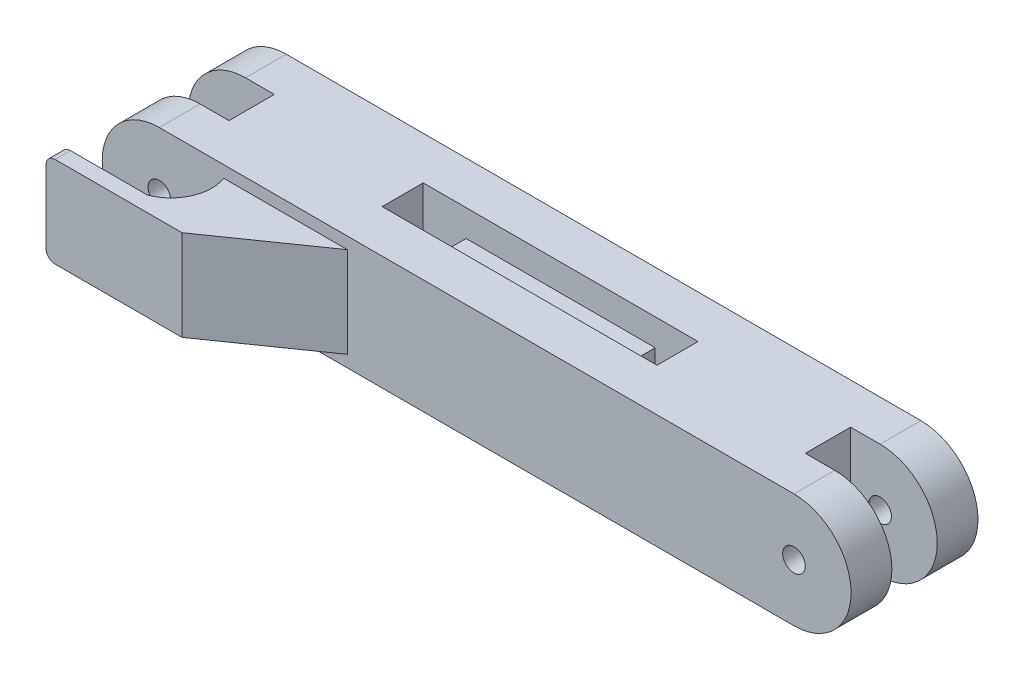
ISO-10303-21;
HEADER;
FILE_DESCRIPTION(('STEP AP214'),'2;1');
FILE_NAME('part.step','',(''),(''),'','','');
FILE_SCHEMA(('AUTOMOTIVE_DESIGN { 1 0 10303 214 1 1 1 1 }'));
ENDSEC;
DATA;
#1=APPLICATION_CONTEXT('core data for automotive mechanical design processes');
#2=APPLICATION_PROTOCOL_DEFINITION('international standard','automotive_design',2000,#1);
#3=PRODUCT_CONTEXT('',#1,'mechanical');
#4=PRODUCT('Part','Part','',(#3));
#5=PRODUCT_RELATED_PRODUCT_CATEGORY('part','',(#4));
#6=PRODUCT_DEFINITION_FORMATION('','',#4);
#7=PRODUCT_DEFINITION_CONTEXT('part definition',#1,'design');
#8=PRODUCT_DEFINITION('design','',#6,#7);
#9=PRODUCT_DEFINITION_SHAPE('','',#8);
#10=(LENGTH_UNIT() NAMED_UNIT(*) SI_UNIT(.MILLI.,.METRE.));
#11=(NAMED_UNIT(*) PLANE_ANGLE_UNIT() SI_UNIT($,.RADIAN.));
#12=(NAMED_UNIT(*) SI_UNIT($,.STERADIAN.) SOLID_ANGLE_UNIT());
#13=UNCERTAINTY_MEASURE_WITH_UNIT(LENGTH_MEASURE(1.E-05),#10,'distance_accuracy_value','');
#14=(GEOMETRIC_REPRESENTATION_CONTEXT(3) GLOBAL_UNCERTAINTY_ASSIGNED_CONTEXT((#13)) GLOBAL_UNIT_ASSIGNED_CONTEXT((#10,
#11,#12)) REPRESENTATION_CONTEXT('',''));
#15=CARTESIAN_POINT('',(0.,0.,0.));
#16=DIRECTION('',(0.,0.,1.));
#17=DIRECTION('',(1.,0.,0.));
#18=AXIS2_PLACEMENT_3D('',#15,#16,#17);
#19=CARTESIAN_POINT('',(-47.2173913043478,-24.0760869565217,11.43));
#20=DIRECTION('',(0.,1.,0.));
#21=DIRECTION('',(0.,0.,1.));
#22=AXIS2_PLACEMENT_3D('',#19,#20,#21);
#23=PLANE('',#22);
#24=DIRECTION('',(-1.,0.,0.));
#25=VECTOR('',#24,1.);
#26=CARTESIAN_POINT('',(-47.2173913043478,-24.0760869565217,23.53));
#27=LINE('',#26,#25);
#28=CARTESIAN_POINT('',(80.1826086956522,-24.0760869565217,23.53));
#29=VERTEX_POINT('',#28);
#30=CARTESIAN_POINT('',(68.1826086956522,-24.0760869565217,23.53));
#31=VERTEX_POINT('',#30);
#32=EDGE_CURVE('E462',#29,#31,#27,.T.);
#33=ORIENTED_EDGE('',*,*,#32,.F.);
#34=DIRECTION('',(0.,0.,-1.));
#35=VECTOR('',#34,1.);
#36=CARTESIAN_POINT('',(80.1826086956522,-24.0760869565217,11.43));
#37=LINE('',#36,#35);
#38=CARTESIAN_POINT('',(80.1826086956522,-24.0760869565217,12.03));
#39=VERTEX_POINT('',#38);
#40=EDGE_CURVE('E455',#29,#39,#37,.T.);
#41=ORIENTED_EDGE('',*,*,#40,.T.);
#42=DIRECTION('',(-1.,0.,0.));
#43=VECTOR('',#42,1.);
#44=CARTESIAN_POINT('',(-47.2173913043478,-24.0760869565217,12.03));
#45=LINE('',#44,#43);
#46=CARTESIAN_POINT('',(68.1826086956522,-24.0760869565217,12.03));
#47=VERTEX_POINT('',#46);
#48=EDGE_CURVE('E457',#39,#47,#45,.T.);
#49=ORIENTED_EDGE('',*,*,#48,.T.);
#50=DIRECTION('',(0.,0.,-1.));
#51=VECTOR('',#50,1.);
#52=CARTESIAN_POINT('',(68.1826086956522,-24.0760869565217,11.43));
#53=LINE('',#52,#51);
#54=EDGE_CURVE('E456',#31,#47,#53,.T.);
#55=ORIENTED_EDGE('',*,*,#54,.F.);
#56=EDGE_LOOP('',(#33,#41,#49,#55));
#57=FACE_BOUND('',#56,.T.);
#58=DIRECTION('',(1.,0.,0.));
#59=VECTOR('',#58,1.);
#60=CARTESIAN_POINT('',(-47.2173913043478,-24.0760869565217,0.));
#61=LINE('',#60,#59);
#62=CARTESIAN_POINT('',(-47.2173913043478,-24.0760869565217,0.));
#63=VERTEX_POINT('',#62);
#64=CARTESIAN_POINT('',(130.582608695652,-24.0760869565217,0.));
#65=VERTEX_POINT('',#64);
#66=EDGE_CURVE('E422',#63,#65,#61,.T.);
#67=ORIENTED_EDGE('',*,*,#66,.T.);
#68=DIRECTION('',(0.,0.,-1.));
#69=VECTOR('',#68,1.);
#70=CARTESIAN_POINT('',(130.582608695652,-24.0760869565217,11.43));
#71=LINE('',#70,#69);
#72=CARTESIAN_POINT('',(130.582608695652,-24.0760869565217,11.43));
#73=VERTEX_POINT('',#72);
#74=EDGE_CURVE('E440',#73,#65,#71,.T.);
#75=ORIENTED_EDGE('',*,*,#74,.F.);
#76=DIRECTION('',(1.,0.,0.));
#77=VECTOR('',#76,1.);
#78=CARTESIAN_POINT('',(-47.2173913043478,-24.0760869565217,11.43));
#79=LINE('',#78,#77);
#80=CARTESIAN_POINT('',(122.327608695652,-24.0760869565217,11.43));
#81=VERTEX_POINT('',#80);
#82=EDGE_CURVE('E406',#81,#73,#79,.T.);
#83=ORIENTED_EDGE('',*,*,#82,.F.);
#84=DIRECTION('',(0.,0.,-1.));
#85=VECTOR('',#84,1.);
#86=CARTESIAN_POINT('',(122.327608695652,-24.0760869565217,24.13));
#87=LINE('',#86,#85);
#88=CARTESIAN_POINT('',(122.327608695652,-24.0760869565217,24.13));
#89=VERTEX_POINT('',#88);
#90=EDGE_CURVE('E373',#89,#81,#87,.T.);
#91=ORIENTED_EDGE('',*,*,#90,.F.);
#92=DIRECTION('',(1.,0.,0.));
#93=VECTOR('',#92,1.);
#94=CARTESIAN_POINT('',(-47.2173913043478,-24.0760869565217,24.13));
#95=LINE('',#94,#93);
#96=CARTESIAN_POINT('',(130.582608695652,-24.0760869565217,24.13));
#97=VERTEX_POINT('',#96);
#98=EDGE_CURVE('E327',#89,#97,#95,.T.);
#99=ORIENTED_EDGE('',*,*,#98,.T.);
#100=DIRECTION('',(0.,0.,-1.));
#101=VECTOR('',#100,1.);
#102=CARTESIAN_POINT('',(130.582608695652,-24.0760869565217,35.56));
#103=LINE('',#102,#101);
#104=CARTESIAN_POINT('',(130.582608695652,-24.0760869565217,35.56));
#105=VERTEX_POINT('',#104);
#106=EDGE_CURVE('E344',#105,#97,#103,.T.);
#107=ORIENTED_EDGE('',*,*,#106,.F.);
#108=DIRECTION('',(1.,0.,0.));
#109=VECTOR('',#108,1.);
#110=CARTESIAN_POINT('',(-47.2173913043478,-24.0760869565217,35.56));
#111=LINE('',#110,#109);
#112=CARTESIAN_POINT('',(-47.2173913043478,-24.0760869565217,35.56));
#113=VERTEX_POINT('',#112);
#114=EDGE_CURVE('E315',#113,#105,#111,.T.);
#115=ORIENTED_EDGE('',*,*,#114,.F.);
#116=DIRECTION('',(0.,0.,-1.));
#117=VECTOR('',#116,1.);
#118=CARTESIAN_POINT('',(-47.2173913043478,-24.0760869565217,35.56));
#119=LINE('',#118,#117);
#120=CARTESIAN_POINT('',(-47.2173913043478,-24.0760869565217,24.13));
#121=VERTEX_POINT('',#120);
#122=EDGE_CURVE('E349',#113,#121,#119,.T.);
#123=ORIENTED_EDGE('',*,*,#122,.T.);
#124=CARTESIAN_POINT('',(-39.1366529566885,-24.0760869565217,24.13));
#125=VERTEX_POINT('',#124);
#126=EDGE_CURVE('E330',#121,#125,#95,.T.);
#127=ORIENTED_EDGE('',*,*,#126,.T.);
#128=DIRECTION('',(0.,0.,-1.));
#129=VECTOR('',#128,1.);
#130=CARTESIAN_POINT('',(-39.1366529566885,-24.0760869565217,24.13));
#131=LINE('',#130,#129);
#132=CARTESIAN_POINT('',(-39.1366529566885,-24.0760869565217,11.43));
#133=VERTEX_POINT('',#132);
#134=EDGE_CURVE('E380',#125,#133,#131,.T.);
#135=ORIENTED_EDGE('',*,*,#134,.T.);
#136=CARTESIAN_POINT('',(-47.2173913043478,-24.0760869565217,11.43));
#137=VERTEX_POINT('',#136);
#138=EDGE_CURVE('E407',#137,#133,#79,.T.);
#139=ORIENTED_EDGE('',*,*,#138,.F.);
#140=DIRECTION('',(0.,0.,-1.));
#141=VECTOR('',#140,1.);
#142=CARTESIAN_POINT('',(-47.2173913043478,-24.0760869565217,11.43));
#143=LINE('',#142,#141);
#144=EDGE_CURVE('E441',#137,#63,#143,.T.);
#145=ORIENTED_EDGE('',*,*,#144,.T.);
#146=EDGE_LOOP('',(#67,#75,#83,#91,#99,#107,#115,#123,#127,#135,#139,#145));
#147=FACE_BOUND('',#146,.T.);
#148=DIRECTION('',(1.,0.,0.));
#149=VECTOR('',#148,1.);
#150=CARTESIAN_POINT('',(-47.2173913043478,-24.0760869565217,12.03));
#151=LINE('',#150,#149);
#152=CARTESIAN_POINT('',(3.1826086956522,-24.0760869565217,12.03));
#153=VERTEX_POINT('',#152);
#154=CARTESIAN_POINT('',(15.1826086956522,-24.0760869565217,12.03));
#155=VERTEX_POINT('',#154);
#156=EDGE_CURVE('E11',#153,#155,#151,.T.);
#157=ORIENTED_EDGE('',*,*,#156,.F.);
#158=DIRECTION('',(0.,0.,1.));
#159=VECTOR('',#158,1.);
#160=CARTESIAN_POINT('',(3.1826086956522,-24.0760869565217,11.43));
#161=LINE('',#160,#159);
#162=CARTESIAN_POINT('',(3.1826086956522,-24.0760869565217,23.53));
#163=VERTEX_POINT('',#162);
#164=EDGE_CURVE('E239',#153,#163,#161,.T.);
#165=ORIENTED_EDGE('',*,*,#164,.T.);
#166=DIRECTION('',(1.,0.,0.));
#167=VECTOR('',#166,1.);
#168=CARTESIAN_POINT('',(-47.2173913043478,-24.0760869565217,23.53));
#169=LINE('',#168,#167);
#170=CARTESIAN_POINT('',(15.1826086956522,-24.0760869565217,23.53));
#171=VERTEX_POINT('',#170);
#172=EDGE_CURVE('E53',#163,#171,#169,.T.);
#173=ORIENTED_EDGE('',*,*,#172,.T.);
#174=DIRECTION('',(0.,0.,1.));
#175=VECTOR('',#174,1.);
#176=CARTESIAN_POINT('',(15.1826086956522,-24.0760869565217,11.43));
#177=LINE('',#176,#175);
#178=EDGE_CURVE('E469',#155,#171,#177,.T.);
#179=ORIENTED_EDGE('',*,*,#178,.F.);
#180=EDGE_LOOP('',(#157,#165,#173,#179));
#181=FACE_BOUND('',#180,.T.);
#182=ADVANCED_FACE('F44',(#57,#147,#181),#23,.F.);
#183=CARTESIAN_POINT('',(-47.2173913043478,-8.07608695652174,35.56));
#184=DIRECTION('',(0.,0.,1.));
#185=DIRECTION('',(1.,0.,0.));
#186=AXIS2_PLACEMENT_3D('',#183,#184,#185);
#187=PLANE('',#186);
#188=DIRECTION('',(0.,-1.,0.));
#189=VECTOR('',#188,1.);
#190=CARTESIAN_POINT('',(5.46367495047442,4.62391304347826,35.56));
#191=LINE('',#190,#189);
#192=CARTESIAN_POINT('',(5.46367495047442,4.62391304347826,35.56));
#193=VERTEX_POINT('',#192);
#194=CARTESIAN_POINT('',(5.46367495047442,-20.7760869565217,35.56));
#195=VERTEX_POINT('',#194);
#196=EDGE_CURVE('E491',#193,#195,#191,.T.);
#197=ORIENTED_EDGE('',*,*,#196,.T.);
#198=DIRECTION('',(-1.,0.,0.));
#199=VECTOR('',#198,1.);
#200=CARTESIAN_POINT('',(-34.5173913043478,-20.7760869565217,35.56));
#201=LINE('',#200,#199);
#202=CARTESIAN_POINT('',(-29.1833913043478,-20.7760869565217,35.56));
#203=VERTEX_POINT('',#202);
#204=EDGE_CURVE('E303',#195,#203,#201,.T.);
#205=ORIENTED_EDGE('',*,*,#204,.T.);
#206=DIRECTION('',(0.,1.,0.));
#207=VECTOR('',#206,1.);
#208=CARTESIAN_POINT('',(-29.1833913043478,-25.8560869565217,35.56));
#209=LINE('',#208,#207);
#210=CARTESIAN_POINT('',(-29.1833913043478,4.62391304347826,35.56));
#211=VERTEX_POINT('',#210);
#212=EDGE_CURVE('E508',#203,#211,#209,.T.);
#213=ORIENTED_EDGE('',*,*,#212,.T.);
#214=DIRECTION('',(1.,0.,0.));
#215=VECTOR('',#214,1.);
#216=CARTESIAN_POINT('',(-34.5173913043478,4.62391304347826,35.56));
#217=LINE('',#216,#215);
#218=EDGE_CURVE('E444',#211,#193,#217,.T.);
#219=ORIENTED_EDGE('',*,*,#218,.T.);
#220=EDGE_LOOP('',(#197,#205,#213,#219));
#221=FACE_BOUND('',#220,.T.);
#222=CARTESIAN_POINT('',(-47.2173913043478,-8.07608695652174,35.56));
#223=DIRECTION('',(0.,0.,1.));
#224=DIRECTION('',(1.,0.,0.));
#225=AXIS2_PLACEMENT_3D('',#222,#223,#224);
#226=CIRCLE('',#225,16.);
#227=CARTESIAN_POINT('',(-47.2173913043478,7.92391304347826,35.56));
#228=VERTEX_POINT('',#227);
#229=EDGE_CURVE('E307',#228,#113,#226,.T.);
#230=ORIENTED_EDGE('',*,*,#229,.T.);
#231=ORIENTED_EDGE('',*,*,#114,.T.);
#232=CARTESIAN_POINT('',(130.582608695652,-8.07608695652174,35.56));
#233=DIRECTION('',(0.,0.,1.));
#234=DIRECTION('',(1.,0.,0.));
#235=AXIS2_PLACEMENT_3D('',#232,#233,#234);
#236=CIRCLE('',#235,16.);
#237=CARTESIAN_POINT('',(130.582608695652,7.92391304347826,35.56));
#238=VERTEX_POINT('',#237);
#239=EDGE_CURVE('E317',#105,#238,#236,.T.);
#240=ORIENTED_EDGE('',*,*,#239,.T.);
#241=DIRECTION('',(-1.,0.,0.));
#242=VECTOR('',#241,1.);
#243=CARTESIAN_POINT('',(-47.2173913043478,7.92391304347826,35.56));
#244=LINE('',#243,#242);
#245=EDGE_CURVE('E316',#238,#228,#244,.T.);
#246=ORIENTED_EDGE('',*,*,#245,.T.);
#247=EDGE_LOOP('',(#230,#231,#240,#246));
#248=FACE_BOUND('',#247,.T.);
#249=CARTESIAN_POINT('',(130.582608695652,-8.07608695652174,35.56));
#250=DIRECTION('',(0.,0.,1.));
#251=DIRECTION('',(1.,0.,0.));
#252=AXIS2_PLACEMENT_3D('',#249,#250,#251);
#253=CIRCLE('',#252,3.175);
#254=CARTESIAN_POINT('',(133.757608695652,-8.07608695652174,35.56));
#255=VERTEX_POINT('',#254);
#256=EDGE_CURVE('E293',#255,#255,#253,.T.);
#257=ORIENTED_EDGE('',*,*,#256,.F.);
#258=EDGE_LOOP('',(#257));
#259=FACE_BOUND('',#258,.T.);
#260=CARTESIAN_POINT('',(-47.2173913043478,-8.07608695652174,35.56));
#261=DIRECTION('',(0.,0.,1.));
#262=DIRECTION('',(1.,0.,0.));
#263=AXIS2_PLACEMENT_3D('',#260,#261,#262);
#264=CIRCLE('',#263,3.175);
#265=CARTESIAN_POINT('',(-44.0423913043478,-8.07608695652174,35.56));
#266=VERTEX_POINT('',#265);
#267=EDGE_CURVE('E299',#266,#266,#264,.T.);
#268=ORIENTED_EDGE('',*,*,#267,.F.);
#269=EDGE_LOOP('',(#268));
#270=FACE_BOUND('',#269,.T.);
#271=ADVANCED_FACE('F596',(#221,#248,#259,#270),#187,.T.);
#272=CARTESIAN_POINT('',(-47.2173913043478,7.92391304347826,11.43));
#273=DIRECTION('',(0.,-1.,0.));
#274=DIRECTION('',(0.,0.,-1.));
#275=AXIS2_PLACEMENT_3D('',#272,#273,#274);
#276=PLANE('',#275);
#277=DIRECTION('',(-1.,0.,0.));
#278=VECTOR('',#277,1.);
#279=CARTESIAN_POINT('',(-47.2173913043478,7.92391304347826,0.));
#280=LINE('',#279,#278);
#281=CARTESIAN_POINT('',(130.582608695652,7.92391304347826,0.));
#282=VERTEX_POINT('',#281);
#283=CARTESIAN_POINT('',(-47.2173913043478,7.92391304347826,0.));
#284=VERTEX_POINT('',#283);
#285=EDGE_CURVE('E410',#282,#284,#280,.T.);
#286=ORIENTED_EDGE('',*,*,#285,.T.);
#287=DIRECTION('',(0.,0.,-1.));
#288=VECTOR('',#287,1.);
#289=CARTESIAN_POINT('',(-47.2173913043478,7.92391304347826,11.43));
#290=LINE('',#289,#288);
#291=CARTESIAN_POINT('',(-47.2173913043478,7.92391304347826,11.43));
#292=VERTEX_POINT('',#291);
#293=EDGE_CURVE('E417',#292,#284,#290,.T.);
#294=ORIENTED_EDGE('',*,*,#293,.F.);
#295=DIRECTION('',(-1.,0.,0.));
#296=VECTOR('',#295,1.);
#297=CARTESIAN_POINT('',(-47.2173913043478,7.92391304347826,11.43));
#298=LINE('',#297,#296);
#299=CARTESIAN_POINT('',(-39.1366529566885,7.92391304347826,11.43));
#300=VERTEX_POINT('',#299);
#301=EDGE_CURVE('E414',#300,#292,#298,.T.);
#302=ORIENTED_EDGE('',*,*,#301,.F.);
#303=DIRECTION('',(0.,0.,-1.));
#304=VECTOR('',#303,1.);
#305=CARTESIAN_POINT('',(-39.1366529566885,7.92391304347824,24.13));
#306=LINE('',#305,#304);
#307=CARTESIAN_POINT('',(-39.1366529566885,7.92391304347824,24.13));
#308=VERTEX_POINT('',#307);
#309=EDGE_CURVE('E382',#308,#300,#306,.T.);
#310=ORIENTED_EDGE('',*,*,#309,.F.);
#311=DIRECTION('',(-1.,0.,0.));
#312=VECTOR('',#311,1.);
#313=CARTESIAN_POINT('',(-47.2173913043478,7.92391304347826,24.13));
#314=LINE('',#313,#312);
#315=CARTESIAN_POINT('',(-47.2173913043478,7.92391304347826,24.13));
#316=VERTEX_POINT('',#315);
#317=EDGE_CURVE('E333',#308,#316,#314,.T.);
#318=ORIENTED_EDGE('',*,*,#317,.T.);
#319=DIRECTION('',(0.,0.,-1.));
#320=VECTOR('',#319,1.);
#321=CARTESIAN_POINT('',(-47.2173913043478,7.92391304347826,35.56));
#322=LINE('',#321,#320);
#323=EDGE_CURVE('E325',#228,#316,#322,.T.);
#324=ORIENTED_EDGE('',*,*,#323,.F.);
#325=ORIENTED_EDGE('',*,*,#245,.F.);
#326=DIRECTION('',(0.,0.,-1.));
#327=VECTOR('',#326,1.);
#328=CARTESIAN_POINT('',(130.582608695652,7.92391304347826,35.56));
#329=LINE('',#328,#327);
#330=CARTESIAN_POINT('',(130.582608695652,7.92391304347826,24.13));
#331=VERTEX_POINT('',#330);
#332=EDGE_CURVE('E341',#238,#331,#329,.T.);
#333=ORIENTED_EDGE('',*,*,#332,.T.);
#334=CARTESIAN_POINT('',(122.327608695652,7.92391304347826,24.13));
#335=VERTEX_POINT('',#334);
#336=EDGE_CURVE('E312',#331,#335,#314,.T.);
#337=ORIENTED_EDGE('',*,*,#336,.T.);
#338=DIRECTION('',(0.,0.,-1.));
#339=VECTOR('',#338,1.);
#340=CARTESIAN_POINT('',(122.327608695652,7.92391304347826,24.13));
#341=LINE('',#340,#339);
#342=CARTESIAN_POINT('',(122.327608695652,7.92391304347826,11.43));
#343=VERTEX_POINT('',#342);
#344=EDGE_CURVE('E361',#335,#343,#341,.T.);
#345=ORIENTED_EDGE('',*,*,#344,.T.);
#346=CARTESIAN_POINT('',(130.582608695652,7.92391304347826,11.43));
#347=VERTEX_POINT('',#346);
#348=EDGE_CURVE('E411',#347,#343,#298,.T.);
#349=ORIENTED_EDGE('',*,*,#348,.F.);
#350=DIRECTION('',(0.,0.,-1.));
#351=VECTOR('',#350,1.);
#352=CARTESIAN_POINT('',(130.582608695652,7.92391304347826,11.43));
#353=LINE('',#352,#351);
#354=EDGE_CURVE('E433',#347,#282,#353,.T.);
#355=ORIENTED_EDGE('',*,*,#354,.T.);
#356=EDGE_LOOP('',(#286,#294,#302,#310,#318,#324,#325,#333,#337,#345,#349,#355));
#357=FACE_BOUND('',#356,.T.);
#358=DIRECTION('',(0.,0.,-1.));
#359=VECTOR('',#358,1.);
#360=CARTESIAN_POINT('',(3.1826086956522,7.92391304347826,23.53));
#361=LINE('',#360,#359);
#362=CARTESIAN_POINT('',(3.1826086956522,7.92391304347826,23.53));
#363=VERTEX_POINT('',#362);
#364=CARTESIAN_POINT('',(3.1826086956522,7.92391304347826,12.03));
#365=VERTEX_POINT('',#364);
#366=EDGE_CURVE('E266',#363,#365,#361,.T.);
#367=ORIENTED_EDGE('',*,*,#366,.T.);
#368=DIRECTION('',(1.,0.,0.));
#369=VECTOR('',#368,1.);
#370=CARTESIAN_POINT('',(3.1826086956522,7.92391304347826,12.03));
#371=LINE('',#370,#369);
#372=CARTESIAN_POINT('',(80.1826086956522,7.92391304347826,12.03));
#373=VERTEX_POINT('',#372);
#374=EDGE_CURVE('E269',#365,#373,#371,.T.);
#375=ORIENTED_EDGE('',*,*,#374,.T.);
#376=DIRECTION('',(0.,0.,-1.));
#377=VECTOR('',#376,1.);
#378=CARTESIAN_POINT('',(80.1826086956522,7.92391304347826,23.53));
#379=LINE('',#378,#377);
#380=CARTESIAN_POINT('',(80.1826086956522,7.92391304347826,23.53));
#381=VERTEX_POINT('',#380);
#382=EDGE_CURVE('E259',#381,#373,#379,.T.);
#383=ORIENTED_EDGE('',*,*,#382,.F.);
#384=DIRECTION('',(1.,0.,0.));
#385=VECTOR('',#384,1.);
#386=CARTESIAN_POINT('',(3.1826086956522,7.92391304347826,23.53));
#387=LINE('',#386,#385);
#388=EDGE_CURVE('E251',#363,#381,#387,.T.);
#389=ORIENTED_EDGE('',*,*,#388,.F.);
#390=EDGE_LOOP('',(#367,#375,#383,#389));
#391=FACE_BOUND('',#390,.T.);
#392=ADVANCED_FACE('F601',(#357,#391),#276,.F.);
#393=CARTESIAN_POINT('',(-47.2173913043478,-8.07608695652174,11.43));
#394=DIRECTION('',(0.,0.,1.));
#395=DIRECTION('',(1.,0.,0.));
#396=AXIS2_PLACEMENT_3D('',#393,#394,#395);
#397=PLANE('',#396);
#398=DIRECTION('',(0.,1.,0.));
#399=VECTOR('',#398,1.);
#400=CARTESIAN_POINT('',(122.327608695652,-24.0760869565217,11.43));
#401=LINE('',#400,#399);
#402=EDGE_CURVE('E360',#81,#343,#401,.T.);
#403=ORIENTED_EDGE('',*,*,#402,.F.);
#404=ORIENTED_EDGE('',*,*,#82,.T.);
#405=CARTESIAN_POINT('',(130.582608695652,-8.07608695652174,11.43));
#406=DIRECTION('',(0.,0.,1.));
#407=DIRECTION('',(1.,0.,0.));
#408=AXIS2_PLACEMENT_3D('',#405,#406,#407);
#409=CIRCLE('',#408,16.);
#410=EDGE_CURVE('E412',#73,#347,#409,.T.);
#411=ORIENTED_EDGE('',*,*,#410,.T.);
#412=ORIENTED_EDGE('',*,*,#348,.T.);
#413=EDGE_LOOP('',(#403,#404,#411,#412));
#414=FACE_BOUND('',#413,.T.);
#415=CARTESIAN_POINT('',(130.582608695652,-8.07608695652174,11.43));
#416=DIRECTION('',(0.,0.,1.));
#417=DIRECTION('',(1.,0.,0.));
#418=AXIS2_PLACEMENT_3D('',#415,#416,#417);
#419=CIRCLE('',#418,3.175);
#420=CARTESIAN_POINT('',(133.757608695652,-8.07608695652174,11.43));
#421=VERTEX_POINT('',#420);
#422=EDGE_CURVE('E386',#421,#421,#419,.T.);
#423=ORIENTED_EDGE('',*,*,#422,.F.);
#424=EDGE_LOOP('',(#423));
#425=FACE_BOUND('',#424,.T.);
#426=ADVANCED_FACE('F673',(#414,#425),#397,.T.);
#427=DIRECTION('',(0.,-1.,0.));
#428=VECTOR('',#427,1.);
#429=CARTESIAN_POINT('',(-39.1366529566885,-24.0760869565217,11.43));
#430=LINE('',#429,#428);
#431=EDGE_CURVE('E352',#300,#133,#430,.T.);
#432=ORIENTED_EDGE('',*,*,#431,.F.);
#433=ORIENTED_EDGE('',*,*,#301,.T.);
#434=CARTESIAN_POINT('',(-47.2173913043478,-8.07608695652174,11.43));
#435=DIRECTION('',(0.,0.,1.));
#436=DIRECTION('',(1.,0.,0.));
#437=AXIS2_PLACEMENT_3D('',#434,#435,#436);
#438=CIRCLE('',#437,16.);
#439=EDGE_CURVE('E405',#292,#137,#438,.T.);
#440=ORIENTED_EDGE('',*,*,#439,.T.);
#441=ORIENTED_EDGE('',*,*,#138,.T.);
#442=EDGE_LOOP('',(#432,#433,#440,#441));
#443=FACE_BOUND('',#442,.T.);
#444=CARTESIAN_POINT('',(-47.2173913043478,-8.07608695652174,11.43));
#445=DIRECTION('',(0.,0.,1.));
#446=DIRECTION('',(1.,0.,0.));
#447=AXIS2_PLACEMENT_3D('',#444,#445,#446);
#448=CIRCLE('',#447,3.175);
#449=CARTESIAN_POINT('',(-44.0423913043478,-8.07608695652174,11.43));
#450=VERTEX_POINT('',#449);
#451=EDGE_CURVE('E394',#450,#450,#448,.T.);
#452=ORIENTED_EDGE('',*,*,#451,.F.);
#453=EDGE_LOOP('',(#452));
#454=FACE_BOUND('',#453,.T.);
#455=ADVANCED_FACE('F680',(#443,#454),#397,.T.);
#456=CARTESIAN_POINT('',(-47.2173913043478,-8.07608695652174,0.));
#457=DIRECTION('',(0.,0.,1.));
#458=DIRECTION('',(1.,0.,0.));
#459=AXIS2_PLACEMENT_3D('',#456,#457,#458);
#460=PLANE('',#459);
#461=CARTESIAN_POINT('',(-47.2173913043478,-8.07608695652174,0.));
#462=DIRECTION('',(0.,0.,1.));
#463=DIRECTION('',(1.,0.,0.));
#464=AXIS2_PLACEMENT_3D('',#461,#462,#463);
#465=CIRCLE('',#464,16.);
#466=EDGE_CURVE('E397',#284,#63,#465,.T.);
#467=ORIENTED_EDGE('',*,*,#466,.F.);
#468=ORIENTED_EDGE('',*,*,#285,.F.);
#469=CARTESIAN_POINT('',(130.582608695652,-8.07608695652174,0.));
#470=DIRECTION('',(0.,0.,1.));
#471=DIRECTION('',(1.,0.,0.));
#472=AXIS2_PLACEMENT_3D('',#469,#470,#471);
#473=CIRCLE('',#472,16.);
#474=EDGE_CURVE('E424',#65,#282,#473,.T.);
#475=ORIENTED_EDGE('',*,*,#474,.F.);
#476=ORIENTED_EDGE('',*,*,#66,.F.);
#477=EDGE_LOOP('',(#467,#468,#475,#476));
#478=FACE_BOUND('',#477,.T.);
#479=CARTESIAN_POINT('',(-47.2173913043478,-8.07608695652174,0.));
#480=DIRECTION('',(0.,0.,1.));
#481=DIRECTION('',(1.,0.,0.));
#482=AXIS2_PLACEMENT_3D('',#479,#480,#481);
#483=CIRCLE('',#482,3.175);
#484=CARTESIAN_POINT('',(-44.0423913043478,-8.07608695652174,0.));
#485=VERTEX_POINT('',#484);
#486=EDGE_CURVE('E389',#485,#485,#483,.T.);
#487=ORIENTED_EDGE('',*,*,#486,.T.);
#488=EDGE_LOOP('',(#487));
#489=FACE_BOUND('',#488,.T.);
#490=CARTESIAN_POINT('',(130.582608695652,-8.07608695652174,0.));
#491=DIRECTION('',(0.,0.,1.));
#492=DIRECTION('',(1.,0.,0.));
#493=AXIS2_PLACEMENT_3D('',#490,#491,#492);
#494=CIRCLE('',#493,3.175);
#495=CARTESIAN_POINT('',(133.757608695652,-8.07608695652174,0.));
#496=VERTEX_POINT('',#495);
#497=EDGE_CURVE('E383',#496,#496,#494,.T.);
#498=ORIENTED_EDGE('',*,*,#497,.T.);
#499=EDGE_LOOP('',(#498));
#500=FACE_BOUND('',#499,.T.);
#501=ADVANCED_FACE('F674',(#478,#489,#500),#460,.F.);
#502=CARTESIAN_POINT('',(-47.2173913043478,-8.07608695652174,11.43));
#503=DIRECTION('',(0.,0.,-1.));
#504=DIRECTION('',(-1.,0.,0.));
#505=AXIS2_PLACEMENT_3D('',#502,#503,#504);
#506=CYLINDRICAL_SURFACE('',#505,16.);
#507=ORIENTED_EDGE('',*,*,#466,.T.);
#508=ORIENTED_EDGE('',*,*,#144,.F.);
#509=ORIENTED_EDGE('',*,*,#439,.F.);
#510=ORIENTED_EDGE('',*,*,#293,.T.);
#511=EDGE_LOOP('',(#507,#508,#509,#510));
#512=FACE_BOUND('',#511,.T.);
#513=ADVANCED_FACE('F50',(#512),#506,.T.);
#514=CARTESIAN_POINT('',(130.582608695652,-8.07608695652174,11.43));
#515=DIRECTION('',(0.,0.,-1.));
#516=DIRECTION('',(-1.,0.,0.));
#517=AXIS2_PLACEMENT_3D('',#514,#515,#516);
#518=CYLINDRICAL_SURFACE('',#517,16.);
#519=ORIENTED_EDGE('',*,*,#474,.T.);
#520=ORIENTED_EDGE('',*,*,#354,.F.);
#521=ORIENTED_EDGE('',*,*,#410,.F.);
#522=ORIENTED_EDGE('',*,*,#74,.T.);
#523=EDGE_LOOP('',(#519,#520,#521,#522));
#524=FACE_BOUND('',#523,.T.);
#525=ADVANCED_FACE('F670',(#524),#518,.T.);
#526=CARTESIAN_POINT('',(-47.2173913043478,-8.07608695652174,11.43));
#527=DIRECTION('',(0.,0.,-1.));
#528=DIRECTION('',(-1.,0.,0.));
#529=AXIS2_PLACEMENT_3D('',#526,#527,#528);
#530=CYLINDRICAL_SURFACE('',#529,3.175);
#531=ORIENTED_EDGE('',*,*,#451,.T.);
#532=EDGE_LOOP('',(#531));
#533=FACE_BOUND('',#532,.T.);
#534=ORIENTED_EDGE('',*,*,#486,.F.);
#535=EDGE_LOOP('',(#534));
#536=FACE_BOUND('',#535,.T.);
#537=ADVANCED_FACE('F669',(#533,#536),#530,.F.);
#538=CARTESIAN_POINT('',(130.582608695652,-8.07608695652174,11.43));
#539=DIRECTION('',(0.,0.,-1.));
#540=DIRECTION('',(-1.,0.,0.));
#541=AXIS2_PLACEMENT_3D('',#538,#539,#540);
#542=CYLINDRICAL_SURFACE('',#541,3.175);
#543=ORIENTED_EDGE('',*,*,#422,.T.);
#544=EDGE_LOOP('',(#543));
#545=FACE_BOUND('',#544,.T.);
#546=ORIENTED_EDGE('',*,*,#497,.F.);
#547=EDGE_LOOP('',(#546));
#548=FACE_BOUND('',#547,.T.);
#549=ADVANCED_FACE('F685',(#545,#548),#542,.F.);
#550=CARTESIAN_POINT('',(-39.1366529566885,-24.0760869565217,24.13));
#551=DIRECTION('',(1.,0.,0.));
#552=DIRECTION('',(0.,0.,-1.));
#553=AXIS2_PLACEMENT_3D('',#550,#551,#552);
#554=PLANE('',#553);
#555=ORIENTED_EDGE('',*,*,#431,.T.);
#556=ORIENTED_EDGE('',*,*,#134,.F.);
#557=DIRECTION('',(0.,-1.,0.));
#558=VECTOR('',#557,1.);
#559=CARTESIAN_POINT('',(-39.1366529566885,-24.0760869565217,24.13));
#560=LINE('',#559,#558);
#561=EDGE_CURVE('E353',#308,#125,#560,.T.);
#562=ORIENTED_EDGE('',*,*,#561,.F.);
#563=ORIENTED_EDGE('',*,*,#309,.T.);
#564=EDGE_LOOP('',(#555,#556,#562,#563));
#565=FACE_BOUND('',#564,.T.);
#566=ADVANCED_FACE('F686',(#565),#554,.F.);
#567=CARTESIAN_POINT('',(122.327608695652,-24.0760869565217,24.13));
#568=DIRECTION('',(-1.,0.,0.));
#569=DIRECTION('',(0.,0.,1.));
#570=AXIS2_PLACEMENT_3D('',#567,#568,#569);
#571=PLANE('',#570);
#572=ORIENTED_EDGE('',*,*,#402,.T.);
#573=ORIENTED_EDGE('',*,*,#344,.F.);
#574=DIRECTION('',(0.,1.,0.));
#575=VECTOR('',#574,1.);
#576=CARTESIAN_POINT('',(122.327608695652,-24.0760869565217,24.13));
#577=LINE('',#576,#575);
#578=EDGE_CURVE('E356',#89,#335,#577,.T.);
#579=ORIENTED_EDGE('',*,*,#578,.F.);
#580=ORIENTED_EDGE('',*,*,#90,.T.);
#581=EDGE_LOOP('',(#572,#573,#579,#580));
#582=FACE_BOUND('',#581,.T.);
#583=ADVANCED_FACE('F625',(#582),#571,.F.);
#584=CARTESIAN_POINT('',(-47.2173913043478,-8.07608695652174,24.13));
#585=DIRECTION('',(0.,0.,1.));
#586=DIRECTION('',(1.,0.,0.));
#587=AXIS2_PLACEMENT_3D('',#584,#585,#586);
#588=PLANE('',#587);
#589=CARTESIAN_POINT('',(-47.2173913043478,-8.07608695652174,24.13));
#590=DIRECTION('',(0.,0.,1.));
#591=DIRECTION('',(1.,0.,0.));
#592=AXIS2_PLACEMENT_3D('',#589,#590,#591);
#593=CIRCLE('',#592,3.175);
#594=CARTESIAN_POINT('',(-44.0423913043478,-8.07608695652174,24.13));
#595=VERTEX_POINT('',#594);
#596=EDGE_CURVE('E294',#595,#595,#593,.T.);
#597=ORIENTED_EDGE('',*,*,#596,.T.);
#598=EDGE_LOOP('',(#597));
#599=FACE_BOUND('',#598,.T.);
#600=ORIENTED_EDGE('',*,*,#317,.F.);
#601=ORIENTED_EDGE('',*,*,#561,.T.);
#602=ORIENTED_EDGE('',*,*,#126,.F.);
#603=CARTESIAN_POINT('',(-47.2173913043478,-8.07608695652174,24.13));
#604=DIRECTION('',(0.,0.,1.));
#605=DIRECTION('',(1.,0.,0.));
#606=AXIS2_PLACEMENT_3D('',#603,#604,#605);
#607=CIRCLE('',#606,16.);
#608=EDGE_CURVE('E308',#316,#121,#607,.T.);
#609=ORIENTED_EDGE('',*,*,#608,.F.);
#610=EDGE_LOOP('',(#600,#601,#602,#609));
#611=FACE_BOUND('',#610,.T.);
#612=ADVANCED_FACE('F616',(#599,#611),#588,.F.);
#613=CARTESIAN_POINT('',(130.582608695652,-8.07608695652174,24.13));
#614=DIRECTION('',(0.,0.,1.));
#615=DIRECTION('',(1.,0.,0.));
#616=AXIS2_PLACEMENT_3D('',#613,#614,#615);
#617=CIRCLE('',#616,3.175);
#618=CARTESIAN_POINT('',(133.757608695652,-8.07608695652174,24.13));
#619=VERTEX_POINT('',#618);
#620=EDGE_CURVE('E289',#619,#619,#617,.T.);
#621=ORIENTED_EDGE('',*,*,#620,.T.);
#622=EDGE_LOOP('',(#621));
#623=FACE_BOUND('',#622,.T.);
#624=ORIENTED_EDGE('',*,*,#98,.F.);
#625=ORIENTED_EDGE('',*,*,#578,.T.);
#626=ORIENTED_EDGE('',*,*,#336,.F.);
#627=CARTESIAN_POINT('',(130.582608695652,-8.07608695652174,24.13));
#628=DIRECTION('',(0.,0.,1.));
#629=DIRECTION('',(1.,0.,0.));
#630=AXIS2_PLACEMENT_3D('',#627,#628,#629);
#631=CIRCLE('',#630,16.);
#632=EDGE_CURVE('E331',#97,#331,#631,.T.);
#633=ORIENTED_EDGE('',*,*,#632,.F.);
#634=EDGE_LOOP('',(#624,#625,#626,#633));
#635=FACE_BOUND('',#634,.T.);
#636=ADVANCED_FACE('F623',(#623,#635),#588,.F.);
#637=CARTESIAN_POINT('',(-47.2173913043478,-8.07608695652174,35.56));
#638=DIRECTION('',(0.,0.,-1.));
#639=DIRECTION('',(-1.,0.,0.));
#640=AXIS2_PLACEMENT_3D('',#637,#638,#639);
#641=CYLINDRICAL_SURFACE('',#640,16.);
#642=ORIENTED_EDGE('',*,*,#608,.T.);
#643=ORIENTED_EDGE('',*,*,#122,.F.);
#644=ORIENTED_EDGE('',*,*,#229,.F.);
#645=ORIENTED_EDGE('',*,*,#323,.T.);
#646=EDGE_LOOP('',(#642,#643,#644,#645));
#647=FACE_BOUND('',#646,.T.);
#648=ADVANCED_FACE('F650',(#647),#641,.T.);
#649=CARTESIAN_POINT('',(130.582608695652,-8.07608695652174,35.56));
#650=DIRECTION('',(0.,0.,-1.));
#651=DIRECTION('',(-1.,0.,0.));
#652=AXIS2_PLACEMENT_3D('',#649,#650,#651);
#653=CYLINDRICAL_SURFACE('',#652,16.);
#654=ORIENTED_EDGE('',*,*,#632,.T.);
#655=ORIENTED_EDGE('',*,*,#332,.F.);
#656=ORIENTED_EDGE('',*,*,#239,.F.);
#657=ORIENTED_EDGE('',*,*,#106,.T.);
#658=EDGE_LOOP('',(#654,#655,#656,#657));
#659=FACE_BOUND('',#658,.T.);
#660=ADVANCED_FACE('F613',(#659),#653,.T.);
#661=CARTESIAN_POINT('',(-47.2173913043478,-8.07608695652174,35.56));
#662=DIRECTION('',(0.,0.,-1.));
#663=DIRECTION('',(-1.,0.,0.));
#664=AXIS2_PLACEMENT_3D('',#661,#662,#663);
#665=CYLINDRICAL_SURFACE('',#664,3.175);
#666=ORIENTED_EDGE('',*,*,#267,.T.);
#667=EDGE_LOOP('',(#666));
#668=FACE_BOUND('',#667,.T.);
#669=ORIENTED_EDGE('',*,*,#596,.F.);
#670=EDGE_LOOP('',(#669));
#671=FACE_BOUND('',#670,.T.);
#672=ADVANCED_FACE('F606',(#668,#671),#665,.F.);
#673=CARTESIAN_POINT('',(130.582608695652,-8.07608695652174,35.56));
#674=DIRECTION('',(0.,0.,-1.));
#675=DIRECTION('',(-1.,0.,0.));
#676=AXIS2_PLACEMENT_3D('',#673,#674,#675);
#677=CYLINDRICAL_SURFACE('',#676,3.175);
#678=ORIENTED_EDGE('',*,*,#256,.T.);
#679=EDGE_LOOP('',(#678));
#680=FACE_BOUND('',#679,.T.);
#681=ORIENTED_EDGE('',*,*,#620,.F.);
#682=EDGE_LOOP('',(#681));
#683=FACE_BOUND('',#682,.T.);
#684=ADVANCED_FACE('F612',(#680,#683),#677,.F.);
#685=CARTESIAN_POINT('',(3.1826086956522,0.423913043478259,23.53));
#686=DIRECTION('',(1.,0.,0.));
#687=DIRECTION('',(0.,0.,-1.));
#688=AXIS2_PLACEMENT_3D('',#685,#686,#687);
#689=PLANE('',#688);
#690=ORIENTED_EDGE('',*,*,#366,.F.);
#691=DIRECTION('',(0.,1.,0.));
#692=VECTOR('',#691,1.);
#693=CARTESIAN_POINT('',(3.1826086956522,0.423913043478259,23.53));
#694=LINE('',#693,#692);
#695=EDGE_CURVE('E61',#163,#363,#694,.T.);
#696=ORIENTED_EDGE('',*,*,#695,.F.);
#697=ORIENTED_EDGE('',*,*,#164,.F.);
#698=DIRECTION('',(0.,1.,0.));
#699=VECTOR('',#698,1.);
#700=CARTESIAN_POINT('',(3.1826086956522,0.423913043478259,12.03));
#701=LINE('',#700,#699);
#702=EDGE_CURVE('E286',#153,#365,#701,.T.);
#703=ORIENTED_EDGE('',*,*,#702,.T.);
#704=EDGE_LOOP('',(#690,#696,#697,#703));
#705=FACE_BOUND('',#704,.T.);
#706=ADVANCED_FACE('F800',(#705),#689,.T.);
#707=CARTESIAN_POINT('',(3.1826086956522,0.423913043478259,12.03));
#708=DIRECTION('',(0.,0.,1.));
#709=DIRECTION('',(1.,0.,0.));
#710=AXIS2_PLACEMENT_3D('',#707,#708,#709);
#711=PLANE('',#710);
#712=ORIENTED_EDGE('',*,*,#374,.F.);
#713=ORIENTED_EDGE('',*,*,#702,.F.);
#714=ORIENTED_EDGE('',*,*,#156,.T.);
#715=DIRECTION('',(0.,1.,0.));
#716=VECTOR('',#715,1.);
#717=CARTESIAN_POINT('',(15.1826086956522,-50.3760869565217,12.03));
#718=LINE('',#717,#716);
#719=CARTESIAN_POINT('',(15.1826086956522,0.423913043478259,12.03));
#720=VERTEX_POINT('',#719);
#721=EDGE_CURVE('E233',#155,#720,#718,.T.);
#722=ORIENTED_EDGE('',*,*,#721,.T.);
#723=DIRECTION('',(1.,0.,0.));
#724=VECTOR('',#723,1.);
#725=CARTESIAN_POINT('',(3.1826086956522,0.423913043478259,12.03));
#726=LINE('',#725,#724);
#727=CARTESIAN_POINT('',(68.1826086956522,0.423913043478259,12.03));
#728=VERTEX_POINT('',#727);
#729=EDGE_CURVE('E232',#720,#728,#726,.T.);
#730=ORIENTED_EDGE('',*,*,#729,.T.);
#731=DIRECTION('',(0.,1.,0.));
#732=VECTOR('',#731,1.);
#733=CARTESIAN_POINT('',(68.1826086956522,-50.3760869565217,12.03));
#734=LINE('',#733,#732);
#735=EDGE_CURVE('E482',#47,#728,#734,.T.);
#736=ORIENTED_EDGE('',*,*,#735,.F.);
#737=ORIENTED_EDGE('',*,*,#48,.F.);
#738=DIRECTION('',(0.,1.,0.));
#739=VECTOR('',#738,1.);
#740=CARTESIAN_POINT('',(80.1826086956522,0.423913043478259,12.03));
#741=LINE('',#740,#739);
#742=EDGE_CURVE('E283',#39,#373,#741,.T.);
#743=ORIENTED_EDGE('',*,*,#742,.T.);
#744=EDGE_LOOP('',(#712,#713,#714,#722,#730,#736,#737,#743));
#745=FACE_BOUND('',#744,.T.);
#746=ADVANCED_FACE('F235',(#745),#711,.T.);
#747=CARTESIAN_POINT('',(80.1826086956522,0.423913043478259,23.53));
#748=DIRECTION('',(1.,0.,0.));
#749=DIRECTION('',(0.,0.,-1.));
#750=AXIS2_PLACEMENT_3D('',#747,#748,#749);
#751=PLANE('',#750);
#752=ORIENTED_EDGE('',*,*,#382,.T.);
#753=ORIENTED_EDGE('',*,*,#742,.F.);
#754=ORIENTED_EDGE('',*,*,#40,.F.);
#755=DIRECTION('',(0.,1.,0.));
#756=VECTOR('',#755,1.);
#757=CARTESIAN_POINT('',(80.1826086956522,0.423913043478259,23.53));
#758=LINE('',#757,#756);
#759=EDGE_CURVE('E279',#29,#381,#758,.T.);
#760=ORIENTED_EDGE('',*,*,#759,.T.);
#761=EDGE_LOOP('',(#752,#753,#754,#760));
#762=FACE_BOUND('',#761,.T.);
#763=ADVANCED_FACE('F827',(#762),#751,.F.);
#764=CARTESIAN_POINT('',(3.1826086956522,0.423913043478259,23.53));
#765=DIRECTION('',(0.,0.,1.));
#766=DIRECTION('',(1.,0.,0.));
#767=AXIS2_PLACEMENT_3D('',#764,#765,#766);
#768=PLANE('',#767);
#769=ORIENTED_EDGE('',*,*,#388,.T.);
#770=ORIENTED_EDGE('',*,*,#759,.F.);
#771=ORIENTED_EDGE('',*,*,#32,.T.);
#772=DIRECTION('',(0.,1.,0.));
#773=VECTOR('',#772,1.);
#774=CARTESIAN_POINT('',(68.1826086956522,-50.3760869565217,23.53));
#775=LINE('',#774,#773);
#776=CARTESIAN_POINT('',(68.1826086956522,0.423913043478259,23.53));
#777=VERTEX_POINT('',#776);
#778=EDGE_CURVE('E488',#31,#777,#775,.T.);
#779=ORIENTED_EDGE('',*,*,#778,.T.);
#780=DIRECTION('',(1.,0.,0.));
#781=VECTOR('',#780,1.);
#782=CARTESIAN_POINT('',(3.1826086956522,0.423913043478259,23.53));
#783=LINE('',#782,#781);
#784=CARTESIAN_POINT('',(15.1826086956522,0.423913043478259,23.53));
#785=VERTEX_POINT('',#784);
#786=EDGE_CURVE('E254',#785,#777,#783,.T.);
#787=ORIENTED_EDGE('',*,*,#786,.F.);
#788=DIRECTION('',(0.,1.,0.));
#789=VECTOR('',#788,1.);
#790=CARTESIAN_POINT('',(15.1826086956522,-50.3760869565217,23.53));
#791=LINE('',#790,#789);
#792=EDGE_CURVE('E69',#171,#785,#791,.T.);
#793=ORIENTED_EDGE('',*,*,#792,.F.);
#794=ORIENTED_EDGE('',*,*,#172,.F.);
#795=ORIENTED_EDGE('',*,*,#695,.T.);
#796=EDGE_LOOP('',(#769,#770,#771,#779,#787,#793,#794,#795));
#797=FACE_BOUND('',#796,.T.);
#798=ADVANCED_FACE('F471',(#797),#768,.F.);
#799=CARTESIAN_POINT('',(0.,0.423913043478259,0.));
#800=DIRECTION('',(0.,-1.,0.));
#801=DIRECTION('',(0.,0.,-1.));
#802=AXIS2_PLACEMENT_3D('',#799,#800,#801);
#803=PLANE('',#802);
#804=ORIENTED_EDGE('',*,*,#729,.F.);
#805=DIRECTION('',(0.,0.,1.));
#806=VECTOR('',#805,1.);
#807=CARTESIAN_POINT('',(15.1826086956522,0.423913043478259,12.03));
#808=LINE('',#807,#806);
#809=EDGE_CURVE('E245',#720,#785,#808,.T.);
#810=ORIENTED_EDGE('',*,*,#809,.T.);
#811=ORIENTED_EDGE('',*,*,#786,.T.);
#812=DIRECTION('',(0.,0.,-1.));
#813=VECTOR('',#812,1.);
#814=CARTESIAN_POINT('',(68.1826086956522,0.423913043478259,23.53));
#815=LINE('',#814,#813);
#816=EDGE_CURVE('E252',#777,#728,#815,.T.);
#817=ORIENTED_EDGE('',*,*,#816,.T.);
#818=EDGE_LOOP('',(#804,#810,#811,#817));
#819=FACE_BOUND('',#818,.T.);
#820=ADVANCED_FACE('F248',(#819),#803,.F.);
#821=CARTESIAN_POINT('',(-57.3773913043478,-18.2360869565217,54.61));
#822=DIRECTION('',(0.,0.,-1.));
#823=DIRECTION('',(-1.,0.,0.));
#824=AXIS2_PLACEMENT_3D('',#821,#822,#823);
#825=PLANE('',#824);
#826=CARTESIAN_POINT('',(-57.3773913043478,-18.2360869565217,54.61));
#827=DIRECTION('',(0.,0.,-1.));
#828=DIRECTION('',(-1.,0.,0.));
#829=AXIS2_PLACEMENT_3D('',#826,#827,#828);
#830=CIRCLE('',#829,2.54);
#831=CARTESIAN_POINT('',(-57.3773913043478,-20.7760869565217,54.61));
#832=VERTEX_POINT('',#831);
#833=CARTESIAN_POINT('',(-59.9173913043478,-18.2360869565217,54.61));
#834=VERTEX_POINT('',#833);
#835=EDGE_CURVE('E523',#832,#834,#830,.T.);
#836=ORIENTED_EDGE('',*,*,#835,.F.);
#837=DIRECTION('',(1.,0.,0.));
#838=VECTOR('',#837,1.);
#839=CARTESIAN_POINT('',(-34.5173913043478,-20.7760869565217,54.61));
#840=LINE('',#839,#838);
#841=CARTESIAN_POINT('',(-21.8173913043478,-20.7760869565217,54.61));
#842=VERTEX_POINT('',#841);
#843=EDGE_CURVE('E539',#832,#842,#840,.T.);
#844=ORIENTED_EDGE('',*,*,#843,.T.);
#845=DIRECTION('',(0.,-1.,0.));
#846=VECTOR('',#845,1.);
#847=CARTESIAN_POINT('',(-21.8173913043478,4.62391304347826,54.61));
#848=LINE('',#847,#846);
#849=CARTESIAN_POINT('',(-21.8173913043478,4.62391304347826,54.61));
#850=VERTEX_POINT('',#849);
#851=EDGE_CURVE('E540',#850,#842,#848,.T.);
#852=ORIENTED_EDGE('',*,*,#851,.F.);
#853=DIRECTION('',(-1.,0.,0.));
#854=VECTOR('',#853,1.);
#855=CARTESIAN_POINT('',(-34.5173913043478,4.62391304347826,54.61));
#856=LINE('',#855,#854);
#857=CARTESIAN_POINT('',(-57.3773913043478,4.62391304347826,54.61));
#858=VERTEX_POINT('',#857);
#859=EDGE_CURVE('E534',#850,#858,#856,.T.);
#860=ORIENTED_EDGE('',*,*,#859,.T.);
#861=CARTESIAN_POINT('',(-57.3773913043478,2.08391304347826,54.61));
#862=DIRECTION('',(0.,0.,1.));
#863=DIRECTION('',(1.,0.,0.));
#864=AXIS2_PLACEMENT_3D('',#861,#862,#863);
#865=CIRCLE('',#864,2.54);
#866=CARTESIAN_POINT('',(-59.9173913043478,2.08391304347824,54.61));
#867=VERTEX_POINT('',#866);
#868=EDGE_CURVE('E532',#858,#867,#865,.T.);
#869=ORIENTED_EDGE('',*,*,#868,.T.);
#870=DIRECTION('',(0.,1.,0.));
#871=VECTOR('',#870,1.);
#872=CARTESIAN_POINT('',(-59.9173913043478,-18.2360869565217,54.61));
#873=LINE('',#872,#871);
#874=EDGE_CURVE('E530',#834,#867,#873,.T.);
#875=ORIENTED_EDGE('',*,*,#874,.F.);
#876=EDGE_LOOP('',(#836,#844,#852,#860,#869,#875));
#877=FACE_BOUND('',#876,.T.);
#878=ADVANCED_FACE('F571',(#877),#825,.F.);
#879=CARTESIAN_POINT('',(-59.9173913043478,-18.2360869565217,54.61));
#880=DIRECTION('',(-1.,0.,0.));
#881=DIRECTION('',(0.,0.,1.));
#882=AXIS2_PLACEMENT_3D('',#879,#880,#881);
#883=PLANE('',#882);
#884=DIRECTION('',(0.,1.,0.));
#885=VECTOR('',#884,1.);
#886=CARTESIAN_POINT('',(-59.9173913043478,-25.8560869565217,50.3102214046145));
#887=LINE('',#886,#885);
#888=CARTESIAN_POINT('',(-59.9173913043478,-18.2360869565217,50.3102214046145));
#889=VERTEX_POINT('',#888);
#890=CARTESIAN_POINT('',(-59.9173913043478,2.08391304347826,50.3102214046145));
#891=VERTEX_POINT('',#890);
#892=EDGE_CURVE('E507',#889,#891,#887,.T.);
#893=ORIENTED_EDGE('',*,*,#892,.F.);
#894=DIRECTION('',(0.,0.,-1.));
#895=VECTOR('',#894,1.);
#896=CARTESIAN_POINT('',(-59.9173913043478,-18.2360869565217,54.61));
#897=LINE('',#896,#895);
#898=EDGE_CURVE('E263',#834,#889,#897,.T.);
#899=ORIENTED_EDGE('',*,*,#898,.F.);
#900=ORIENTED_EDGE('',*,*,#874,.T.);
#901=DIRECTION('',(0.,0.,-1.));
#902=VECTOR('',#901,1.);
#903=CARTESIAN_POINT('',(-59.9173913043478,2.08391304347824,54.61));
#904=LINE('',#903,#902);
#905=EDGE_CURVE('E554',#867,#891,#904,.T.);
#906=ORIENTED_EDGE('',*,*,#905,.T.);
#907=EDGE_LOOP('',(#893,#899,#900,#906));
#908=FACE_BOUND('',#907,.T.);
#909=ADVANCED_FACE('F567',(#908),#883,.T.);
#910=CARTESIAN_POINT('',(-57.3773913043478,2.08391304347826,54.61));
#911=DIRECTION('',(0.,0.,-1.));
#912=DIRECTION('',(-1.,0.,0.));
#913=AXIS2_PLACEMENT_3D('',#910,#911,#912);
#914=CYLINDRICAL_SURFACE('',#913,2.54);
#915=DIRECTION('',(0.,0.,-1.));
#916=VECTOR('',#915,1.);
#917=CARTESIAN_POINT('',(-57.3773913043478,4.62391304347826,54.61));
#918=LINE('',#917,#916);
#919=CARTESIAN_POINT('',(-57.3773913043478,4.62391304347825,50.3102214046145));
#920=VERTEX_POINT('',#919);
#921=EDGE_CURVE('E552',#858,#920,#918,.T.);
#922=ORIENTED_EDGE('',*,*,#921,.T.);
#923=CARTESIAN_POINT('',(-57.3773913043478,2.08391304347826,50.3102214046145));
#924=DIRECTION('',(0.,0.,1.));
#925=DIRECTION('',(1.,0.,0.));
#926=AXIS2_PLACEMENT_3D('',#923,#924,#925);
#927=CIRCLE('',#926,2.54);
#928=EDGE_CURVE('E302',#920,#891,#927,.T.);
#929=ORIENTED_EDGE('',*,*,#928,.T.);
#930=ORIENTED_EDGE('',*,*,#905,.F.);
#931=ORIENTED_EDGE('',*,*,#868,.F.);
#932=EDGE_LOOP('',(#922,#929,#930,#931));
#933=FACE_BOUND('',#932,.T.);
#934=ADVANCED_FACE('F580',(#933),#914,.T.);
#935=CARTESIAN_POINT('',(-34.5173913043478,4.62391304347826,54.61));
#936=DIRECTION('',(0.,1.,0.));
#937=DIRECTION('',(-1.,0.,0.));
#938=AXIS2_PLACEMENT_3D('',#935,#936,#937);
#939=PLANE('',#938);
#940=DIRECTION('',(1.,0.,0.));
#941=VECTOR('',#940,1.);
#942=CARTESIAN_POINT('',(-59.9173913043478,4.62391304347825,50.3102214046145));
#943=LINE('',#942,#941);
#944=CARTESIAN_POINT('',(-35.7955595202095,4.62391304347826,50.3102214046145));
#945=VERTEX_POINT('',#944);
#946=EDGE_CURVE('E499',#920,#945,#943,.T.);
#947=ORIENTED_EDGE('',*,*,#946,.F.);
#948=ORIENTED_EDGE('',*,*,#921,.F.);
#949=ORIENTED_EDGE('',*,*,#859,.F.);
#950=DIRECTION('',(-0.819891394326568,0.,0.572519083969466));
#951=VECTOR('',#950,1.);
#952=CARTESIAN_POINT('',(-21.8173913043478,4.62391304347826,54.61));
#953=LINE('',#952,#951);
#954=EDGE_CURVE('E489',#193,#850,#953,.T.);
#955=ORIENTED_EDGE('',*,*,#954,.F.);
#956=ORIENTED_EDGE('',*,*,#218,.F.);
#957=CARTESIAN_POINT('',(-39.8645861145859,4.62391304347826,39.6290265943764));
#958=DIRECTION('',(0.,1.,0.));
#959=DIRECTION('',(1.,0.,0.));
#960=AXIS2_PLACEMENT_3D('',#957,#958,#959);
#961=CIRCLE('',#960,11.43);
#962=EDGE_CURVE('E502',#945,#211,#961,.T.);
#963=ORIENTED_EDGE('',*,*,#962,.F.);
#964=EDGE_LOOP('',(#947,#948,#949,#955,#956,#963));
#965=FACE_BOUND('',#964,.T.);
#966=ADVANCED_FACE('F583',(#965),#939,.T.);
#967=CARTESIAN_POINT('',(-34.5173913043478,-20.7760869565217,54.61));
#968=DIRECTION('',(0.,-1.,0.));
#969=DIRECTION('',(0.,0.,-1.));
#970=AXIS2_PLACEMENT_3D('',#967,#968,#969);
#971=PLANE('',#970);
#972=CARTESIAN_POINT('',(-39.8645861145859,-20.7760869565217,39.6290265943764));
#973=DIRECTION('',(0.,-1.,0.));
#974=DIRECTION('',(0.,0.,-1.));
#975=AXIS2_PLACEMENT_3D('',#972,#973,#974);
#976=CIRCLE('',#975,11.43);
#977=CARTESIAN_POINT('',(-35.7955595202095,-20.7760869565217,50.3102214046145));
#978=VERTEX_POINT('',#977);
#979=EDGE_CURVE('E446',#203,#978,#976,.T.);
#980=ORIENTED_EDGE('',*,*,#979,.F.);
#981=ORIENTED_EDGE('',*,*,#204,.F.);
#982=DIRECTION('',(-0.819891394326568,0.,0.572519083969466));
#983=VECTOR('',#982,1.);
#984=CARTESIAN_POINT('',(-21.8173913043478,-20.7760869565217,54.61));
#985=LINE('',#984,#983);
#986=EDGE_CURVE('E490',#195,#842,#985,.T.);
#987=ORIENTED_EDGE('',*,*,#986,.T.);
#988=ORIENTED_EDGE('',*,*,#843,.F.);
#989=DIRECTION('',(0.,0.,-1.));
#990=VECTOR('',#989,1.);
#991=CARTESIAN_POINT('',(-57.3773913043478,-20.7760869565217,54.61));
#992=LINE('',#991,#990);
#993=CARTESIAN_POINT('',(-57.3773913043478,-20.7760869565217,50.3102214046145));
#994=VERTEX_POINT('',#993);
#995=EDGE_CURVE('E272',#832,#994,#992,.T.);
#996=ORIENTED_EDGE('',*,*,#995,.T.);
#997=DIRECTION('',(-1.,0.,0.));
#998=VECTOR('',#997,1.);
#999=CARTESIAN_POINT('',(-34.5173913043478,-20.7760869565217,50.3102214046145));
#1000=LINE('',#999,#998);
#1001=EDGE_CURVE('E515',#978,#994,#1000,.T.);
#1002=ORIENTED_EDGE('',*,*,#1001,.F.);
#1003=EDGE_LOOP('',(#980,#981,#987,#988,#996,#1002));
#1004=FACE_BOUND('',#1003,.T.);
#1005=ADVANCED_FACE('F595',(#1004),#971,.T.);
#1006=CARTESIAN_POINT('',(-57.3773913043478,-18.2360869565217,54.61));
#1007=DIRECTION('',(0.,0.,-1.));
#1008=DIRECTION('',(-1.,0.,0.));
#1009=AXIS2_PLACEMENT_3D('',#1006,#1007,#1008);
#1010=CYLINDRICAL_SURFACE('',#1009,2.54);
#1011=CARTESIAN_POINT('',(-57.3773913043478,-18.2360869565217,50.3102214046145));
#1012=DIRECTION('',(0.,0.,1.));
#1013=DIRECTION('',(1.,0.,0.));
#1014=AXIS2_PLACEMENT_3D('',#1011,#1012,#1013);
#1015=CIRCLE('',#1014,2.54);
#1016=EDGE_CURVE('E447',#994,#889,#1015,.F.);
#1017=ORIENTED_EDGE('',*,*,#1016,.F.);
#1018=ORIENTED_EDGE('',*,*,#995,.F.);
#1019=ORIENTED_EDGE('',*,*,#835,.T.);
#1020=ORIENTED_EDGE('',*,*,#898,.T.);
#1021=EDGE_LOOP('',(#1017,#1018,#1019,#1020));
#1022=FACE_BOUND('',#1021,.T.);
#1023=ADVANCED_FACE('F564',(#1022),#1010,.T.);
#1024=CARTESIAN_POINT('',(-59.9173913043478,-25.8560869565217,50.3102214046145));
#1025=DIRECTION('',(0.,0.,1.));
#1026=DIRECTION('',(1.,0.,0.));
#1027=AXIS2_PLACEMENT_3D('',#1024,#1025,#1026);
#1028=PLANE('',#1027);
#1029=ORIENTED_EDGE('',*,*,#946,.T.);
#1030=DIRECTION('',(0.,1.,0.));
#1031=VECTOR('',#1030,1.);
#1032=CARTESIAN_POINT('',(-35.7955595202095,-25.8560869565217,50.3102214046145));
#1033=LINE('',#1032,#1031);
#1034=EDGE_CURVE('E514',#978,#945,#1033,.T.);
#1035=ORIENTED_EDGE('',*,*,#1034,.F.);
#1036=ORIENTED_EDGE('',*,*,#1001,.T.);
#1037=ORIENTED_EDGE('',*,*,#1016,.T.);
#1038=ORIENTED_EDGE('',*,*,#892,.T.);
#1039=ORIENTED_EDGE('',*,*,#928,.F.);
#1040=EDGE_LOOP('',(#1029,#1035,#1036,#1037,#1038,#1039));
#1041=FACE_BOUND('',#1040,.T.);
#1042=ADVANCED_FACE('F578',(#1041),#1028,.F.);
#1043=CARTESIAN_POINT('',(-39.8645861145859,-25.8560869565217,39.6290265943764));
#1044=DIRECTION('',(0.,1.,0.));
#1045=DIRECTION('',(-1.,0.,0.));
#1046=AXIS2_PLACEMENT_3D('',#1043,#1044,#1045);
#1047=CYLINDRICAL_SURFACE('',#1046,11.43);
#1048=ORIENTED_EDGE('',*,*,#979,.T.);
#1049=ORIENTED_EDGE('',*,*,#1034,.T.);
#1050=ORIENTED_EDGE('',*,*,#962,.T.);
#1051=ORIENTED_EDGE('',*,*,#212,.F.);
#1052=EDGE_LOOP('',(#1048,#1049,#1050,#1051));
#1053=FACE_BOUND('',#1052,.T.);
#1054=ADVANCED_FACE('F588',(#1053),#1047,.F.);
#1055=CARTESIAN_POINT('',(-21.8173913043478,4.62391304347826,54.61));
#1056=DIRECTION('',(0.572519083969466,0.,0.819891394326568));
#1057=DIRECTION('',(0.819891394326568,0.,-0.572519083969466));
#1058=AXIS2_PLACEMENT_3D('',#1055,#1056,#1057);
#1059=PLANE('',#1058);
#1060=ORIENTED_EDGE('',*,*,#986,.F.);
#1061=ORIENTED_EDGE('',*,*,#196,.F.);
#1062=ORIENTED_EDGE('',*,*,#954,.T.);
#1063=ORIENTED_EDGE('',*,*,#851,.T.);
#1064=EDGE_LOOP('',(#1060,#1061,#1062,#1063));
#1065=FACE_BOUND('',#1064,.T.);
#1066=ADVANCED_FACE('F594',(#1065),#1059,.T.);
#1067=CARTESIAN_POINT('',(68.1826086956522,-50.3760869565217,23.53));
#1068=DIRECTION('',(1.,0.,0.));
#1069=DIRECTION('',(0.,0.,-1.));
#1070=AXIS2_PLACEMENT_3D('',#1067,#1068,#1069);
#1071=PLANE('',#1070);
#1072=ORIENTED_EDGE('',*,*,#54,.T.);
#1073=ORIENTED_EDGE('',*,*,#735,.T.);
#1074=ORIENTED_EDGE('',*,*,#816,.F.);
#1075=ORIENTED_EDGE('',*,*,#778,.F.);
#1076=EDGE_LOOP('',(#1072,#1073,#1074,#1075));
#1077=FACE_BOUND('',#1076,.T.);
#1078=ADVANCED_FACE('F955',(#1077),#1071,.T.);
#1079=CARTESIAN_POINT('',(15.1826086956522,-50.3760869565217,12.03));
#1080=DIRECTION('',(-1.,0.,0.));
#1081=DIRECTION('',(0.,0.,1.));
#1082=AXIS2_PLACEMENT_3D('',#1079,#1080,#1081);
#1083=PLANE('',#1082);
#1084=ORIENTED_EDGE('',*,*,#178,.T.);
#1085=ORIENTED_EDGE('',*,*,#792,.T.);
#1086=ORIENTED_EDGE('',*,*,#809,.F.);
#1087=ORIENTED_EDGE('',*,*,#721,.F.);
#1088=EDGE_LOOP('',(#1084,#1085,#1086,#1087));
#1089=FACE_BOUND('',#1088,.T.);
#1090=ADVANCED_FACE('F243',(#1089),#1083,.T.);
#1091=CLOSED_SHELL('',(#182,#271,#392,#426,#455,#501,#513,#525,#537,#549,#566,#583,#612,#636,
#648,#660,#672,#684,#706,#746,#763,#798,#820,#878,#909,#934,#966,#1005,#1023,#1042,#1054,#1066,
#1078,#1090));
#1092=MANIFOLD_SOLID_BREP('B2',#1091);
#1093=ADVANCED_BREP_SHAPE_REPRESENTATION('',(#18,#1092),#14);
#1094=SHAPE_DEFINITION_REPRESENTATION(#9,#1093);
ENDSEC;
END-ISO-10303-21;
